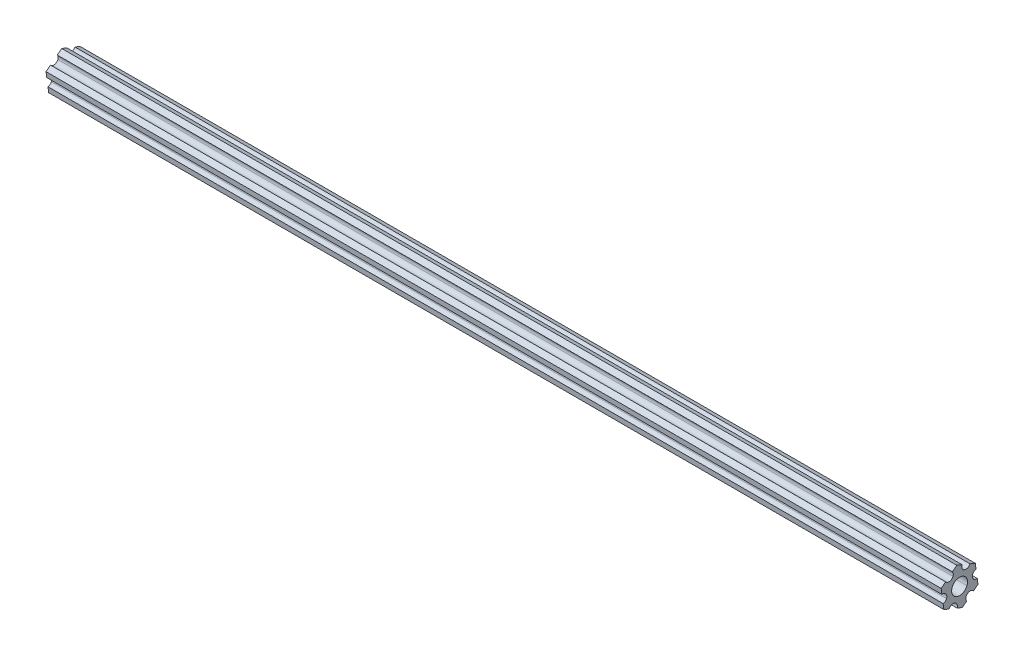
ISO-10303-21;
HEADER;
FILE_DESCRIPTION(('STEP AP214'),'2;1');
FILE_NAME('part.step','',(''),(''),'','','');
FILE_SCHEMA(('AUTOMOTIVE_DESIGN { 1 0 10303 214 1 1 1 1 }'));
ENDSEC;
DATA;
#1=APPLICATION_CONTEXT('core data for automotive mechanical design processes');
#2=APPLICATION_PROTOCOL_DEFINITION('international standard','automotive_design',2000,#1);
#3=PRODUCT_CONTEXT('',#1,'mechanical');
#4=PRODUCT('Part','Part','',(#3));
#5=PRODUCT_RELATED_PRODUCT_CATEGORY('part','',(#4));
#6=PRODUCT_DEFINITION_FORMATION('','',#4);
#7=PRODUCT_DEFINITION_CONTEXT('part definition',#1,'design');
#8=PRODUCT_DEFINITION('design','',#6,#7);
#9=PRODUCT_DEFINITION_SHAPE('','',#8);
#10=(LENGTH_UNIT() NAMED_UNIT(*) SI_UNIT(.MILLI.,.METRE.));
#11=(NAMED_UNIT(*) PLANE_ANGLE_UNIT() SI_UNIT($,.RADIAN.));
#12=(NAMED_UNIT(*) SI_UNIT($,.STERADIAN.) SOLID_ANGLE_UNIT());
#13=UNCERTAINTY_MEASURE_WITH_UNIT(LENGTH_MEASURE(1.E-05),#10,'distance_accuracy_value','');
#14=(GEOMETRIC_REPRESENTATION_CONTEXT(3) GLOBAL_UNCERTAINTY_ASSIGNED_CONTEXT((#13)) GLOBAL_UNIT_ASSIGNED_CONTEXT((#10,
#11,#12)) REPRESENTATION_CONTEXT('',''));
#15=CARTESIAN_POINT('',(0.,0.,0.));
#16=DIRECTION('',(0.,0.,1.));
#17=DIRECTION('',(1.,0.,0.));
#18=AXIS2_PLACEMENT_3D('',#15,#16,#17);
#19=CARTESIAN_POINT('',(270.736860808716,181.994820859661,458.283325004908));
#20=DIRECTION('',(-1.,0.,0.));
#21=DIRECTION('',(0.,-0.375584223552297,-0.926788266552085));
#22=AXIS2_PLACEMENT_3D('',#19,#20,#21);
#23=CYLINDRICAL_SURFACE('',#22,2.9337);
#24=CARTESIAN_POINT('',(140.561860808716,181.994820859661,458.283325004908));
#25=DIRECTION('',(1.,0.,0.));
#26=DIRECTION('',(0.,0.,-1.));
#27=AXIS2_PLACEMENT_3D('',#24,#25,#26);
#28=CIRCLE('',#27,2.9337);
#29=CARTESIAN_POINT('',(140.561860808716,180.892969423026,455.564406267324));
#30=VERTEX_POINT('',#29);
#31=CARTESIAN_POINT('',(140.561860808716,183.096672296296,461.002243742492));
#32=VERTEX_POINT('',#31);
#33=EDGE_CURVE('E72',#30,#32,#28,.F.);
#34=ORIENTED_EDGE('',*,*,#33,.F.);
#35=DIRECTION('',(-1.,0.,0.));
#36=VECTOR('',#35,1.);
#37=CARTESIAN_POINT('',(270.736860808716,180.892969423026,455.564406267324));
#38=LINE('',#37,#36);
#39=CARTESIAN_POINT('',(-189.638139191284,180.892969423026,455.564406267324));
#40=VERTEX_POINT('',#39);
#41=EDGE_CURVE('E225',#30,#40,#38,.T.);
#42=ORIENTED_EDGE('',*,*,#41,.T.);
#43=CARTESIAN_POINT('',(-189.638139191284,181.994820859661,458.283325004908));
#44=DIRECTION('',(1.,0.,0.));
#45=DIRECTION('',(0.,0.375584223552297,0.926788266552085));
#46=AXIS2_PLACEMENT_3D('',#43,#44,#45);
#47=CIRCLE('',#46,2.9337);
#48=CARTESIAN_POINT('',(-189.638139191284,183.096672296296,461.002243742492));
#49=VERTEX_POINT('',#48);
#50=EDGE_CURVE('E245',#49,#40,#47,.T.);
#51=ORIENTED_EDGE('',*,*,#50,.F.);
#52=DIRECTION('',(-1.,0.,0.));
#53=VECTOR('',#52,1.);
#54=CARTESIAN_POINT('',(270.736860808716,183.096672296296,461.002243742492));
#55=LINE('',#54,#53);
#56=EDGE_CURVE('E227',#32,#49,#55,.T.);
#57=ORIENTED_EDGE('',*,*,#56,.F.);
#58=EDGE_LOOP('',(#34,#42,#51,#57));
#59=FACE_BOUND('',#58,.T.);
#60=ADVANCED_FACE('F51',(#59),#23,.F.);
#61=CARTESIAN_POINT('',(270.736860808716,187.002809160181,462.187496259074));
#62=DIRECTION('',(-1.,0.,0.));
#63=DIRECTION('',(0.,-0.375584223552297,-0.926788266552085));
#64=AXIS2_PLACEMENT_3D('',#61,#62,#63);
#65=CYLINDRICAL_SURFACE('',#64,1.5875);
#66=CARTESIAN_POINT('',(140.561860808716,187.002809160181,462.187496259074));
#67=DIRECTION('',(1.,0.,0.));
#68=DIRECTION('',(0.,0.,-1.));
#69=AXIS2_PLACEMENT_3D('',#66,#67,#68);
#70=CIRCLE('',#69,1.5875);
#71=CARTESIAN_POINT('',(140.561860808716,187.978851973722,460.935499183944));
#72=VERTEX_POINT('',#71);
#73=CARTESIAN_POINT('',(140.561860808716,186.406569205292,460.716219885923));
#74=VERTEX_POINT('',#73);
#75=EDGE_CURVE('E66',#72,#74,#70,.F.);
#76=ORIENTED_EDGE('',*,*,#75,.F.);
#77=DIRECTION('',(-1.,0.,0.));
#78=VECTOR('',#77,1.);
#79=CARTESIAN_POINT('',(270.736860808716,187.978851973722,460.935499183944));
#80=LINE('',#79,#78);
#81=CARTESIAN_POINT('',(-189.638139191284,187.978851973722,460.935499183944));
#82=VERTEX_POINT('',#81);
#83=EDGE_CURVE('E59',#72,#82,#80,.T.);
#84=ORIENTED_EDGE('',*,*,#83,.T.);
#85=CARTESIAN_POINT('',(-189.638139191284,187.002809160181,462.187496259074));
#86=DIRECTION('',(-1.,0.,0.));
#87=DIRECTION('',(0.,0.375584223552297,0.926788266552085));
#88=AXIS2_PLACEMENT_3D('',#85,#86,#87);
#89=CIRCLE('',#88,1.5875);
#90=CARTESIAN_POINT('',(-189.638139191284,186.406569205292,460.716219885923));
#91=VERTEX_POINT('',#90);
#92=EDGE_CURVE('E266',#82,#91,#89,.T.);
#93=ORIENTED_EDGE('',*,*,#92,.T.);
#94=DIRECTION('',(-1.,0.,0.));
#95=VECTOR('',#94,1.);
#96=CARTESIAN_POINT('',(270.736860808716,186.406569205292,460.716219885923));
#97=LINE('',#96,#95);
#98=EDGE_CURVE('E233',#74,#91,#97,.T.);
#99=ORIENTED_EDGE('',*,*,#98,.F.);
#100=EDGE_LOOP('',(#76,#84,#93,#99));
#101=FACE_BOUND('',#100,.T.);
#102=ADVANCED_FACE('F53',(#101),#65,.F.);
#103=CARTESIAN_POINT('',(270.736860808716,189.256883484736,459.296132865671));
#104=DIRECTION('',(0.,-0.788659574884989,-0.614830118766338));
#105=DIRECTION('',(1.,0.,0.));
#106=AXIS2_PLACEMENT_3D('',#103,#104,#105);
#107=PLANE('',#106);
#108=DIRECTION('',(0.,-0.614830118766338,0.788659574884988));
#109=VECTOR('',#108,1.);
#110=CARTESIAN_POINT('',(140.561860808716,189.256883484736,459.296132865671));
#111=LINE('',#110,#109);
#112=CARTESIAN_POINT('',(140.561860808716,189.256883484736,459.296132865671));
#113=VERTEX_POINT('',#112);
#114=EDGE_CURVE('E395',#113,#72,#111,.T.);
#115=ORIENTED_EDGE('',*,*,#114,.F.);
#116=DIRECTION('',(-1.,0.,0.));
#117=VECTOR('',#116,1.);
#118=CARTESIAN_POINT('',(270.736860808716,189.256883484736,459.296132865671));
#119=LINE('',#118,#117);
#120=CARTESIAN_POINT('',(-189.638139191284,189.256883484736,459.296132865671));
#121=VERTEX_POINT('',#120);
#122=EDGE_CURVE('E276',#113,#121,#119,.T.);
#123=ORIENTED_EDGE('',*,*,#122,.T.);
#124=DIRECTION('',(0.,-0.614830118766338,0.788659574884989));
#125=VECTOR('',#124,1.);
#126=CARTESIAN_POINT('',(-189.638139191284,189.256883484736,459.296132865671));
#127=LINE('',#126,#125);
#128=EDGE_CURVE('E261',#121,#82,#127,.T.);
#129=ORIENTED_EDGE('',*,*,#128,.T.);
#130=ORIENTED_EDGE('',*,*,#83,.F.);
#131=EDGE_LOOP('',(#115,#123,#129,#130));
#132=FACE_BOUND('',#131,.T.);
#133=ADVANCED_FACE('F488',(#132),#107,.F.);
#134=CARTESIAN_POINT('',(270.736860808716,188.476166362509,457.369641951159));
#135=DIRECTION('',(0.,-0.926788289305943,0.37558416740508));
#136=DIRECTION('',(1.,0.,0.));
#137=AXIS2_PLACEMENT_3D('',#134,#135,#136);
#138=PLANE('',#137);
#139=DIRECTION('',(0.,0.375584167405079,0.926788289305941));
#140=VECTOR('',#139,1.);
#141=CARTESIAN_POINT('',(140.561860808716,188.476166362509,457.369641951159));
#142=LINE('',#141,#140);
#143=CARTESIAN_POINT('',(140.561860808716,188.476166362509,457.369641951159));
#144=VERTEX_POINT('',#143);
#145=EDGE_CURVE('E393',#144,#113,#142,.T.);
#146=ORIENTED_EDGE('',*,*,#145,.F.);
#147=DIRECTION('',(-1.,0.,0.));
#148=VECTOR('',#147,1.);
#149=CARTESIAN_POINT('',(270.736860808716,188.476166362509,457.369641951159));
#150=LINE('',#149,#148);
#151=CARTESIAN_POINT('',(-189.638139191284,188.476166362509,457.369641951159));
#152=VERTEX_POINT('',#151);
#153=EDGE_CURVE('E273',#144,#152,#150,.T.);
#154=ORIENTED_EDGE('',*,*,#153,.T.);
#155=DIRECTION('',(0.,0.37558416740508,0.926788289305943));
#156=VECTOR('',#155,1.);
#157=CARTESIAN_POINT('',(-189.638139191284,188.476166362509,457.369641951159));
#158=LINE('',#157,#156);
#159=EDGE_CURVE('E265',#152,#121,#158,.T.);
#160=ORIENTED_EDGE('',*,*,#159,.T.);
#161=ORIENTED_EDGE('',*,*,#122,.F.);
#162=EDGE_LOOP('',(#146,#154,#160,#161));
#163=FACE_BOUND('',#162,.T.);
#164=ADVANCED_FACE('F495',(#163),#138,.F.);
#165=CARTESIAN_POINT('',(270.736860808716,187.879926496754,455.898365541886));
#166=DIRECTION('',(-1.,0.,0.));
#167=DIRECTION('',(0.,-0.375584223552297,-0.926788266552085));
#168=AXIS2_PLACEMENT_3D('',#165,#166,#167);
#169=CYLINDRICAL_SURFACE('',#168,1.5875);
#170=CARTESIAN_POINT('',(140.561860808716,187.879926496754,455.898365541886));
#171=DIRECTION('',(1.,0.,0.));
#172=DIRECTION('',(0.,0.,-1.));
#173=AXIS2_PLACEMENT_3D('',#170,#171,#172);
#174=CIRCLE('',#173,1.5875);
#175=CARTESIAN_POINT('',(140.561860808716,187.283686630998,454.427089132612));
#176=VERTEX_POINT('',#175);
#177=EDGE_CURVE('E391',#176,#144,#174,.F.);
#178=ORIENTED_EDGE('',*,*,#177,.F.);
#179=DIRECTION('',(-1.,0.,0.));
#180=VECTOR('',#179,1.);
#181=CARTESIAN_POINT('',(270.736860808716,187.283686630998,454.427089132612));
#182=LINE('',#181,#180);
#183=CARTESIAN_POINT('',(-189.638139191284,187.283686630998,454.427089132612));
#184=VERTEX_POINT('',#183);
#185=EDGE_CURVE('E271',#176,#184,#182,.T.);
#186=ORIENTED_EDGE('',*,*,#185,.T.);
#187=CARTESIAN_POINT('',(-189.638139191284,187.879926496754,455.898365541886));
#188=DIRECTION('',(-1.,0.,0.));
#189=DIRECTION('',(0.,0.375584223552297,0.926788266552085));
#190=AXIS2_PLACEMENT_3D('',#187,#188,#189);
#191=CIRCLE('',#190,1.5875);
#192=EDGE_CURVE('E280',#184,#152,#191,.T.);
#193=ORIENTED_EDGE('',*,*,#192,.T.);
#194=ORIENTED_EDGE('',*,*,#153,.F.);
#195=EDGE_LOOP('',(#178,#186,#193,#194));
#196=FACE_BOUND('',#195,.T.);
#197=ADVANCED_FACE('F498',(#196),#169,.F.);
#198=CARTESIAN_POINT('',(270.736860808716,186.502969508772,452.500598218101));
#199=DIRECTION('',(0.,-0.926788289305948,0.375584167405068));
#200=DIRECTION('',(1.,0.,0.));
#201=AXIS2_PLACEMENT_3D('',#198,#199,#200);
#202=PLANE('',#201);
#203=DIRECTION('',(0.,0.375584167405067,0.926788289305946));
#204=VECTOR('',#203,1.);
#205=CARTESIAN_POINT('',(140.561860808716,186.502969508772,452.500598218101));
#206=LINE('',#205,#204);
#207=CARTESIAN_POINT('',(140.561860808716,186.502969508772,452.500598218101));
#208=VERTEX_POINT('',#207);
#209=EDGE_CURVE('E384',#208,#176,#206,.T.);
#210=ORIENTED_EDGE('',*,*,#209,.F.);
#211=DIRECTION('',(-1.,0.,0.));
#212=VECTOR('',#211,1.);
#213=CARTESIAN_POINT('',(270.736860808716,186.502969508772,452.500598218101));
#214=LINE('',#213,#212);
#215=CARTESIAN_POINT('',(-189.638139191284,186.502969508772,452.500598218101));
#216=VERTEX_POINT('',#215);
#217=EDGE_CURVE('E274',#208,#216,#214,.T.);
#218=ORIENTED_EDGE('',*,*,#217,.T.);
#219=DIRECTION('',(0.,0.375584167405068,0.926788289305948));
#220=VECTOR('',#219,1.);
#221=CARTESIAN_POINT('',(-189.638139191284,186.502969508772,452.500598218101));
#222=LINE('',#221,#220);
#223=EDGE_CURVE('E251',#216,#184,#222,.T.);
#224=ORIENTED_EDGE('',*,*,#223,.T.);
#225=ORIENTED_EDGE('',*,*,#185,.F.);
#226=EDGE_LOOP('',(#210,#218,#224,#225));
#227=FACE_BOUND('',#226,.T.);
#228=ADVANCED_FACE('F491',(#227),#202,.F.);
#229=CARTESIAN_POINT('',(270.736860808716,184.444220875531,452.213473621863));
#230=DIRECTION('',(0.,-0.138128714420944,0.990414286171408));
#231=DIRECTION('',(-1.,0.,0.));
#232=AXIS2_PLACEMENT_3D('',#229,#230,#231);
#233=PLANE('',#232);
#234=DIRECTION('',(0.,0.990414286171407,0.138128714420944));
#235=VECTOR('',#234,1.);
#236=CARTESIAN_POINT('',(140.561860808716,184.444220875531,452.213473621863));
#237=LINE('',#236,#235);
#238=CARTESIAN_POINT('',(140.561860808716,184.444220875531,452.213473621863));
#239=VERTEX_POINT('',#238);
#240=EDGE_CURVE('E381',#239,#208,#237,.T.);
#241=ORIENTED_EDGE('',*,*,#240,.F.);
#242=DIRECTION('',(-1.,0.,0.));
#243=VECTOR('',#242,1.);
#244=CARTESIAN_POINT('',(270.736860808716,184.444220875531,452.213473621863));
#245=LINE('',#244,#243);
#246=CARTESIAN_POINT('',(-189.638139191284,184.444220875531,452.213473621863));
#247=VERTEX_POINT('',#246);
#248=EDGE_CURVE('E285',#239,#247,#245,.T.);
#249=ORIENTED_EDGE('',*,*,#248,.T.);
#250=DIRECTION('',(0.,0.990414286171408,0.138128714420944));
#251=VECTOR('',#250,1.);
#252=CARTESIAN_POINT('',(-189.638139191284,184.444220875531,452.213473621863));
#253=LINE('',#252,#251);
#254=EDGE_CURVE('E246',#247,#216,#253,.T.);
#255=ORIENTED_EDGE('',*,*,#254,.T.);
#256=ORIENTED_EDGE('',*,*,#217,.F.);
#257=EDGE_LOOP('',(#241,#249,#255,#256));
#258=FACE_BOUND('',#257,.T.);
#259=ADVANCED_FACE('F635',(#258),#233,.F.);
#260=CARTESIAN_POINT('',(270.736860808716,182.871938196234,451.99419428772));
#261=DIRECTION('',(-1.,0.,0.));
#262=DIRECTION('',(0.,-0.375584223552297,-0.926788266552085));
#263=AXIS2_PLACEMENT_3D('',#260,#261,#262);
#264=CYLINDRICAL_SURFACE('',#263,1.5875);
#265=CARTESIAN_POINT('',(140.561860808716,182.871938196234,451.99419428772));
#266=DIRECTION('',(1.,0.,0.));
#267=DIRECTION('',(0.,0.,-1.));
#268=AXIS2_PLACEMENT_3D('',#265,#266,#267);
#269=CIRCLE('',#268,1.5875);
#270=CARTESIAN_POINT('',(140.561860808716,181.299655516937,451.774914953576));
#271=VERTEX_POINT('',#270);
#272=EDGE_CURVE('E379',#271,#239,#269,.F.);
#273=ORIENTED_EDGE('',*,*,#272,.F.);
#274=DIRECTION('',(-1.,0.,0.));
#275=VECTOR('',#274,1.);
#276=CARTESIAN_POINT('',(270.736860808716,181.299655516937,451.774914953576));
#277=LINE('',#276,#275);
#278=CARTESIAN_POINT('',(-189.638139191284,181.299655516937,451.774914953576));
#279=VERTEX_POINT('',#278);
#280=EDGE_CURVE('E269',#271,#279,#277,.T.);
#281=ORIENTED_EDGE('',*,*,#280,.T.);
#282=CARTESIAN_POINT('',(-189.638139191284,182.871938196234,451.99419428772));
#283=DIRECTION('',(-1.,0.,0.));
#284=DIRECTION('',(0.,0.375584223552297,0.926788266552085));
#285=AXIS2_PLACEMENT_3D('',#282,#283,#284);
#286=CIRCLE('',#285,1.5875);
#287=EDGE_CURVE('E250',#279,#247,#286,.T.);
#288=ORIENTED_EDGE('',*,*,#287,.T.);
#289=ORIENTED_EDGE('',*,*,#248,.F.);
#290=EDGE_LOOP('',(#273,#281,#288,#289));
#291=FACE_BOUND('',#290,.T.);
#292=ADVANCED_FACE('F377',(#291),#264,.F.);
#293=CARTESIAN_POINT('',(270.736860808716,179.240906883697,451.487790357338));
#294=DIRECTION('',(0.,-0.138128714420944,0.990414286171407));
#295=DIRECTION('',(-1.,0.,0.));
#296=AXIS2_PLACEMENT_3D('',#293,#294,#295);
#297=PLANE('',#296);
#298=DIRECTION('',(0.,0.990414286171407,0.138128714420944));
#299=VECTOR('',#298,1.);
#300=CARTESIAN_POINT('',(140.561860808716,179.240906883697,451.487790357338));
#301=LINE('',#300,#299);
#302=CARTESIAN_POINT('',(140.561860808716,179.240906883697,451.487790357338));
#303=VERTEX_POINT('',#302);
#304=EDGE_CURVE('E382',#303,#271,#301,.T.);
#305=ORIENTED_EDGE('',*,*,#304,.F.);
#306=DIRECTION('',(-1.,0.,0.));
#307=VECTOR('',#306,1.);
#308=CARTESIAN_POINT('',(270.736860808716,179.240906883697,451.487790357338));
#309=LINE('',#308,#307);
#310=CARTESIAN_POINT('',(-189.638139191284,179.240906883697,451.487790357338));
#311=VERTEX_POINT('',#310);
#312=EDGE_CURVE('E267',#303,#311,#309,.T.);
#313=ORIENTED_EDGE('',*,*,#312,.T.);
#314=DIRECTION('',(0.,0.990414286171407,0.138128714420944));
#315=VECTOR('',#314,1.);
#316=CARTESIAN_POINT('',(-189.638139191284,179.240906883697,451.487790357338));
#317=LINE('',#316,#315);
#318=EDGE_CURVE('E338',#311,#279,#317,.T.);
#319=ORIENTED_EDGE('',*,*,#318,.T.);
#320=ORIENTED_EDGE('',*,*,#280,.F.);
#321=EDGE_LOOP('',(#305,#313,#319,#320));
#322=FACE_BOUND('',#321,.T.);
#323=ADVANCED_FACE('F374',(#322),#297,.F.);
#324=CARTESIAN_POINT('',(270.736860808716,177.962875372683,453.127156675612));
#325=DIRECTION('',(0.,0.788659574884996,0.614830118766329));
#326=DIRECTION('',(-1.,0.,0.));
#327=AXIS2_PLACEMENT_3D('',#324,#325,#326);
#328=PLANE('',#327);
#329=DIRECTION('',(0.,0.614830118766329,-0.788659574884996));
#330=VECTOR('',#329,1.);
#331=CARTESIAN_POINT('',(140.561860808716,177.962875372683,453.127156675612));
#332=LINE('',#331,#330);
#333=CARTESIAN_POINT('',(140.561860808716,177.962875372683,453.127156675612));
#334=VERTEX_POINT('',#333);
#335=EDGE_CURVE('E386',#334,#303,#332,.T.);
#336=ORIENTED_EDGE('',*,*,#335,.F.);
#337=DIRECTION('',(-1.,0.,0.));
#338=VECTOR('',#337,1.);
#339=CARTESIAN_POINT('',(270.736860808716,177.962875372683,453.127156675612));
#340=LINE('',#339,#338);
#341=CARTESIAN_POINT('',(-189.638139191284,177.962875372683,453.127156675612));
#342=VERTEX_POINT('',#341);
#343=EDGE_CURVE('E270',#334,#342,#340,.T.);
#344=ORIENTED_EDGE('',*,*,#343,.T.);
#345=DIRECTION('',(0.,0.614830118766329,-0.788659574884996));
#346=VECTOR('',#345,1.);
#347=CARTESIAN_POINT('',(-189.638139191284,177.962875372683,453.127156675612));
#348=LINE('',#347,#346);
#349=EDGE_CURVE('E337',#342,#311,#348,.T.);
#350=ORIENTED_EDGE('',*,*,#349,.T.);
#351=ORIENTED_EDGE('',*,*,#312,.F.);
#352=EDGE_LOOP('',(#336,#344,#350,#351));
#353=FACE_BOUND('',#352,.T.);
#354=ADVANCED_FACE('F362',(#353),#328,.F.);
#355=CARTESIAN_POINT('',(270.736860808716,176.986832559141,454.379153750742));
#356=DIRECTION('',(-1.,0.,0.));
#357=DIRECTION('',(0.,-0.375584223552297,-0.926788266552085));
#358=AXIS2_PLACEMENT_3D('',#355,#356,#357);
#359=CYLINDRICAL_SURFACE('',#358,1.5875);
#360=CARTESIAN_POINT('',(140.561860808716,176.986832559141,454.379153750742));
#361=DIRECTION('',(1.,0.,0.));
#362=DIRECTION('',(0.,0.,-1.));
#363=AXIS2_PLACEMENT_3D('',#360,#361,#362);
#364=CIRCLE('',#363,1.5875);
#365=CARTESIAN_POINT('',(140.561860808716,176.0107897456,455.631150825872));
#366=VERTEX_POINT('',#365);
#367=EDGE_CURVE('E439',#366,#334,#364,.F.);
#368=ORIENTED_EDGE('',*,*,#367,.F.);
#369=DIRECTION('',(-1.,0.,0.));
#370=VECTOR('',#369,1.);
#371=CARTESIAN_POINT('',(270.736860808716,176.0107897456,455.631150825872));
#372=LINE('',#371,#370);
#373=CARTESIAN_POINT('',(-189.638139191284,176.0107897456,455.631150825872));
#374=VERTEX_POINT('',#373);
#375=EDGE_CURVE('E281',#366,#374,#372,.T.);
#376=ORIENTED_EDGE('',*,*,#375,.T.);
#377=CARTESIAN_POINT('',(-189.638139191284,176.986832559141,454.379153750742));
#378=DIRECTION('',(-1.,0.,0.));
#379=DIRECTION('',(0.,0.375584223552297,0.926788266552085));
#380=AXIS2_PLACEMENT_3D('',#377,#378,#379);
#381=CIRCLE('',#380,1.5875);
#382=EDGE_CURVE('E332',#374,#342,#381,.T.);
#383=ORIENTED_EDGE('',*,*,#382,.T.);
#384=ORIENTED_EDGE('',*,*,#343,.F.);
#385=EDGE_LOOP('',(#368,#376,#383,#384));
#386=FACE_BOUND('',#385,.T.);
#387=ADVANCED_FACE('F442',(#386),#359,.F.);
#388=CARTESIAN_POINT('',(270.736860808716,174.732758234586,457.270517144145));
#389=DIRECTION('',(0.,0.788659574884989,0.614830118766337));
#390=DIRECTION('',(-1.,0.,0.));
#391=AXIS2_PLACEMENT_3D('',#388,#389,#390);
#392=PLANE('',#391);
#393=DIRECTION('',(0.,0.614830118766337,-0.788659574884989));
#394=VECTOR('',#393,1.);
#395=CARTESIAN_POINT('',(140.561860808716,174.732758234586,457.270517144145));
#396=LINE('',#395,#394);
#397=CARTESIAN_POINT('',(140.561860808716,174.732758234586,457.270517144145));
#398=VERTEX_POINT('',#397);
#399=EDGE_CURVE('E437',#398,#366,#396,.T.);
#400=ORIENTED_EDGE('',*,*,#399,.F.);
#401=DIRECTION('',(-1.,0.,0.));
#402=VECTOR('',#401,1.);
#403=CARTESIAN_POINT('',(270.736860808716,174.732758234586,457.270517144145));
#404=LINE('',#403,#402);
#405=CARTESIAN_POINT('',(-189.638139191284,174.732758234586,457.270517144145));
#406=VERTEX_POINT('',#405);
#407=EDGE_CURVE('E283',#398,#406,#404,.T.);
#408=ORIENTED_EDGE('',*,*,#407,.T.);
#409=DIRECTION('',(0.,0.614830118766337,-0.78865957488499));
#410=VECTOR('',#409,1.);
#411=CARTESIAN_POINT('',(-189.638139191284,174.732758234586,457.270517144145));
#412=LINE('',#411,#410);
#413=EDGE_CURVE('E313',#406,#374,#412,.T.);
#414=ORIENTED_EDGE('',*,*,#413,.T.);
#415=ORIENTED_EDGE('',*,*,#375,.F.);
#416=EDGE_LOOP('',(#400,#408,#414,#415));
#417=FACE_BOUND('',#416,.T.);
#418=ADVANCED_FACE('F449',(#417),#392,.F.);
#419=CARTESIAN_POINT('',(270.736860808716,175.513475356813,459.197008058657));
#420=DIRECTION('',(0.,0.926788289305952,-0.375584167405058));
#421=DIRECTION('',(-1.,0.,0.));
#422=AXIS2_PLACEMENT_3D('',#419,#420,#421);
#423=PLANE('',#422);
#424=DIRECTION('',(0.,-0.375584167405057,-0.926788289305951));
#425=VECTOR('',#424,1.);
#426=CARTESIAN_POINT('',(140.561860808716,175.513475356813,459.197008058657));
#427=LINE('',#426,#425);
#428=CARTESIAN_POINT('',(140.561860808716,175.513475356813,459.197008058657));
#429=VERTEX_POINT('',#428);
#430=EDGE_CURVE('E435',#429,#398,#427,.T.);
#431=ORIENTED_EDGE('',*,*,#430,.F.);
#432=DIRECTION('',(-1.,0.,0.));
#433=VECTOR('',#432,1.);
#434=CARTESIAN_POINT('',(270.736860808716,175.513475356813,459.197008058657));
#435=LINE('',#434,#433);
#436=CARTESIAN_POINT('',(-189.638139191284,175.513475356813,459.197008058657));
#437=VERTEX_POINT('',#436);
#438=EDGE_CURVE('E303',#429,#437,#435,.T.);
#439=ORIENTED_EDGE('',*,*,#438,.T.);
#440=DIRECTION('',(0.,-0.375584167405058,-0.926788289305952));
#441=VECTOR('',#440,1.);
#442=CARTESIAN_POINT('',(-189.638139191284,175.513475356813,459.197008058657));
#443=LINE('',#442,#441);
#444=EDGE_CURVE('E309',#437,#406,#443,.T.);
#445=ORIENTED_EDGE('',*,*,#444,.T.);
#446=ORIENTED_EDGE('',*,*,#407,.F.);
#447=EDGE_LOOP('',(#431,#439,#445,#446));
#448=FACE_BOUND('',#447,.T.);
#449=ADVANCED_FACE('F453',(#448),#423,.F.);
#450=CARTESIAN_POINT('',(270.736860808716,176.109715222568,460.66828446793));
#451=DIRECTION('',(-1.,0.,0.));
#452=DIRECTION('',(0.,-0.375584223552297,-0.926788266552085));
#453=AXIS2_PLACEMENT_3D('',#450,#451,#452);
#454=CYLINDRICAL_SURFACE('',#453,1.5875);
#455=CARTESIAN_POINT('',(140.561860808716,176.109715222568,460.66828446793));
#456=DIRECTION('',(1.,0.,0.));
#457=DIRECTION('',(0.,0.,-1.));
#458=AXIS2_PLACEMENT_3D('',#455,#456,#457);
#459=CIRCLE('',#458,1.5875);
#460=CARTESIAN_POINT('',(140.561860808716,176.705955088324,462.139560877204));
#461=VERTEX_POINT('',#460);
#462=EDGE_CURVE('E433',#461,#429,#459,.F.);
#463=ORIENTED_EDGE('',*,*,#462,.F.);
#464=DIRECTION('',(-1.,0.,0.));
#465=VECTOR('',#464,1.);
#466=CARTESIAN_POINT('',(270.736860808716,176.705955088324,462.139560877204));
#467=LINE('',#466,#465);
#468=CARTESIAN_POINT('',(-189.638139191284,176.705955088324,462.139560877204));
#469=VERTEX_POINT('',#468);
#470=EDGE_CURVE('E301',#461,#469,#467,.T.);
#471=ORIENTED_EDGE('',*,*,#470,.T.);
#472=CARTESIAN_POINT('',(-189.638139191284,176.109715222568,460.66828446793));
#473=DIRECTION('',(-1.,0.,0.));
#474=DIRECTION('',(0.,0.375584223552297,0.926788266552085));
#475=AXIS2_PLACEMENT_3D('',#472,#473,#474);
#476=CIRCLE('',#475,1.5875);
#477=EDGE_CURVE('E312',#469,#437,#476,.T.);
#478=ORIENTED_EDGE('',*,*,#477,.T.);
#479=ORIENTED_EDGE('',*,*,#438,.F.);
#480=EDGE_LOOP('',(#463,#471,#478,#479));
#481=FACE_BOUND('',#480,.T.);
#482=ADVANCED_FACE('F457',(#481),#454,.F.);
#483=CARTESIAN_POINT('',(270.736860808716,177.48667221055,464.066051791715));
#484=DIRECTION('',(0.,0.926788289305948,-0.375584167405068));
#485=DIRECTION('',(-1.,0.,0.));
#486=AXIS2_PLACEMENT_3D('',#483,#484,#485);
#487=PLANE('',#486);
#488=DIRECTION('',(0.,-0.375584167405067,-0.926788289305946));
#489=VECTOR('',#488,1.);
#490=CARTESIAN_POINT('',(140.561860808716,177.48667221055,464.066051791715));
#491=LINE('',#490,#489);
#492=CARTESIAN_POINT('',(140.561860808716,177.48667221055,464.066051791715));
#493=VERTEX_POINT('',#492);
#494=EDGE_CURVE('E431',#493,#461,#491,.T.);
#495=ORIENTED_EDGE('',*,*,#494,.F.);
#496=DIRECTION('',(-1.,0.,0.));
#497=VECTOR('',#496,1.);
#498=CARTESIAN_POINT('',(270.736860808716,177.48667221055,464.066051791715));
#499=LINE('',#498,#497);
#500=CARTESIAN_POINT('',(-189.638139191284,177.48667221055,464.066051791715));
#501=VERTEX_POINT('',#500);
#502=EDGE_CURVE('E304',#493,#501,#499,.T.);
#503=ORIENTED_EDGE('',*,*,#502,.T.);
#504=DIRECTION('',(0.,-0.375584167405068,-0.926788289305948));
#505=VECTOR('',#504,1.);
#506=CARTESIAN_POINT('',(-189.638139191284,177.48667221055,464.066051791715));
#507=LINE('',#506,#505);
#508=EDGE_CURVE('E256',#501,#469,#507,.T.);
#509=ORIENTED_EDGE('',*,*,#508,.T.);
#510=ORIENTED_EDGE('',*,*,#470,.F.);
#511=EDGE_LOOP('',(#495,#503,#509,#510));
#512=FACE_BOUND('',#511,.T.);
#513=ADVANCED_FACE('F463',(#512),#487,.F.);
#514=CARTESIAN_POINT('',(270.736860808716,179.545420843791,464.353176387953));
#515=DIRECTION('',(0.,0.138128714420945,-0.990414286171407));
#516=DIRECTION('',(0.,-0.990414286171407,-0.138128714420945));
#517=AXIS2_PLACEMENT_3D('',#514,#515,#516);
#518=PLANE('',#517);
#519=DIRECTION('',(0.,-0.990414286171407,-0.138128714420945));
#520=VECTOR('',#519,1.);
#521=CARTESIAN_POINT('',(140.561860808716,179.545420843791,464.353176387953));
#522=LINE('',#521,#520);
#523=CARTESIAN_POINT('',(140.561860808716,179.545420843791,464.353176387953));
#524=VERTEX_POINT('',#523);
#525=EDGE_CURVE('E429',#524,#493,#522,.T.);
#526=ORIENTED_EDGE('',*,*,#525,.F.);
#527=DIRECTION('',(-1.,0.,0.));
#528=VECTOR('',#527,1.);
#529=CARTESIAN_POINT('',(270.736860808716,179.545420843791,464.353176387953));
#530=LINE('',#529,#528);
#531=CARTESIAN_POINT('',(-189.638139191284,179.545420843791,464.353176387953));
#532=VERTEX_POINT('',#531);
#533=EDGE_CURVE('E298',#524,#532,#530,.T.);
#534=ORIENTED_EDGE('',*,*,#533,.T.);
#535=DIRECTION('',(0.,-0.990414286171407,-0.138128714420945));
#536=VECTOR('',#535,1.);
#537=CARTESIAN_POINT('',(-189.638139191284,179.545420843791,464.353176387953));
#538=LINE('',#537,#536);
#539=EDGE_CURVE('E252',#532,#501,#538,.T.);
#540=ORIENTED_EDGE('',*,*,#539,.T.);
#541=ORIENTED_EDGE('',*,*,#502,.F.);
#542=EDGE_LOOP('',(#526,#534,#540,#541));
#543=FACE_BOUND('',#542,.T.);
#544=ADVANCED_FACE('F467',(#543),#518,.F.);
#545=CARTESIAN_POINT('',(270.736860808716,181.117703523088,464.572455722096));
#546=DIRECTION('',(-1.,0.,0.));
#547=DIRECTION('',(0.,-0.375584223552297,-0.926788266552085));
#548=AXIS2_PLACEMENT_3D('',#545,#546,#547);
#549=CYLINDRICAL_SURFACE('',#548,1.5875);
#550=CARTESIAN_POINT('',(140.561860808716,181.117703523088,464.572455722096));
#551=DIRECTION('',(1.,0.,0.));
#552=DIRECTION('',(0.,0.,-1.));
#553=AXIS2_PLACEMENT_3D('',#550,#551,#552);
#554=CIRCLE('',#553,1.5875);
#555=CARTESIAN_POINT('',(140.561860808716,182.689986202385,464.79173505624));
#556=VERTEX_POINT('',#555);
#557=CARTESIAN_POINT('',(140.561860808716,180.521463568199,463.101179348945));
#558=VERTEX_POINT('',#557);
#559=EDGE_CURVE('E420',#556,#558,#554,.F.);
#560=ORIENTED_EDGE('',*,*,#559,.F.);
#561=DIRECTION('',(-1.,0.,0.));
#562=VECTOR('',#561,1.);
#563=CARTESIAN_POINT('',(270.736860808716,182.689986202385,464.79173505624));
#564=LINE('',#563,#562);
#565=CARTESIAN_POINT('',(-189.638139191284,182.689986202385,464.79173505624));
#566=VERTEX_POINT('',#565);
#567=EDGE_CURVE('E241',#556,#566,#564,.T.);
#568=ORIENTED_EDGE('',*,*,#567,.T.);
#569=CARTESIAN_POINT('',(-189.638139191284,181.117703523088,464.572455722096));
#570=DIRECTION('',(-1.,0.,0.));
#571=DIRECTION('',(0.,0.375584223552297,0.926788266552085));
#572=AXIS2_PLACEMENT_3D('',#569,#570,#571);
#573=CIRCLE('',#572,1.5875);
#574=CARTESIAN_POINT('',(-189.638139191284,180.521463568199,463.101179348945));
#575=VERTEX_POINT('',#574);
#576=EDGE_CURVE('E255',#566,#575,#573,.T.);
#577=ORIENTED_EDGE('',*,*,#576,.T.);
#578=DIRECTION('',(-1.,0.,0.));
#579=VECTOR('',#578,1.);
#580=CARTESIAN_POINT('',(270.736860808716,180.521463568199,463.101179348945));
#581=LINE('',#580,#579);
#582=EDGE_CURVE('E286',#558,#575,#581,.T.);
#583=ORIENTED_EDGE('',*,*,#582,.F.);
#584=EDGE_LOOP('',(#560,#568,#577,#583));
#585=FACE_BOUND('',#584,.T.);
#586=ADVANCED_FACE('F474',(#585),#549,.F.);
#587=CARTESIAN_POINT('',(270.736860808716,184.748734835625,465.078859652478));
#588=DIRECTION('',(0.,0.138128714420958,-0.990414286171406));
#589=DIRECTION('',(0.,-0.990414286171406,-0.138128714420958));
#590=AXIS2_PLACEMENT_3D('',#587,#588,#589);
#591=PLANE('',#590);
#592=DIRECTION('',(0.,-0.990414286171405,-0.138128714420958));
#593=VECTOR('',#592,1.);
#594=CARTESIAN_POINT('',(140.561860808716,184.748734835625,465.078859652478));
#595=LINE('',#594,#593);
#596=CARTESIAN_POINT('',(140.561860808716,184.748734835625,465.078859652478));
#597=VERTEX_POINT('',#596);
#598=EDGE_CURVE('E418',#597,#556,#595,.T.);
#599=ORIENTED_EDGE('',*,*,#598,.F.);
#600=DIRECTION('',(-1.,0.,0.));
#601=VECTOR('',#600,1.);
#602=CARTESIAN_POINT('',(270.736860808716,184.748734835625,465.078859652478));
#603=LINE('',#602,#601);
#604=CARTESIAN_POINT('',(-189.638139191284,184.748734835625,465.078859652478));
#605=VERTEX_POINT('',#604);
#606=EDGE_CURVE('E243',#597,#605,#603,.T.);
#607=ORIENTED_EDGE('',*,*,#606,.T.);
#608=DIRECTION('',(0.,-0.990414286171406,-0.138128714420958));
#609=VECTOR('',#608,1.);
#610=CARTESIAN_POINT('',(-189.638139191284,184.748734835625,465.078859652478));
#611=LINE('',#610,#609);
#612=EDGE_CURVE('E257',#605,#566,#611,.T.);
#613=ORIENTED_EDGE('',*,*,#612,.T.);
#614=ORIENTED_EDGE('',*,*,#567,.F.);
#615=EDGE_LOOP('',(#599,#607,#613,#614));
#616=FACE_BOUND('',#615,.T.);
#617=ADVANCED_FACE('F416',(#616),#591,.F.);
#618=CARTESIAN_POINT('',(270.736860808716,186.026766346639,463.439493334204));
#619=DIRECTION('',(0.,-0.788659574884997,-0.614830118766327));
#620=DIRECTION('',(1.,0.,0.));
#621=AXIS2_PLACEMENT_3D('',#618,#619,#620);
#622=PLANE('',#621);
#623=DIRECTION('',(0.,-0.614830118766327,0.788659574884997));
#624=VECTOR('',#623,1.);
#625=CARTESIAN_POINT('',(140.561860808716,186.026766346639,463.439493334204));
#626=LINE('',#625,#624);
#627=CARTESIAN_POINT('',(140.561860808716,186.026766346639,463.439493334204));
#628=VERTEX_POINT('',#627);
#629=EDGE_CURVE('E413',#628,#597,#626,.T.);
#630=ORIENTED_EDGE('',*,*,#629,.F.);
#631=DIRECTION('',(-1.,0.,0.));
#632=VECTOR('',#631,1.);
#633=CARTESIAN_POINT('',(270.736860808716,186.026766346639,463.439493334204));
#634=LINE('',#633,#632);
#635=CARTESIAN_POINT('',(-189.638139191284,186.026766346639,463.439493334204));
#636=VERTEX_POINT('',#635);
#637=EDGE_CURVE('E289',#628,#636,#634,.T.);
#638=ORIENTED_EDGE('',*,*,#637,.T.);
#639=DIRECTION('',(0.,-0.614830118766327,0.788659574884997));
#640=VECTOR('',#639,1.);
#641=CARTESIAN_POINT('',(-189.638139191284,186.026766346639,463.439493334204));
#642=LINE('',#641,#640);
#643=EDGE_CURVE('E300',#636,#605,#642,.T.);
#644=ORIENTED_EDGE('',*,*,#643,.T.);
#645=ORIENTED_EDGE('',*,*,#606,.F.);
#646=EDGE_LOOP('',(#630,#638,#644,#645));
#647=FACE_BOUND('',#646,.T.);
#648=ADVANCED_FACE('F412',(#647),#622,.F.);
#649=CARTESIAN_POINT('',(270.736860808716,181.117703523088,464.572455722096));
#650=DIRECTION('',(-1.,0.,0.));
#651=DIRECTION('',(0.,-0.375584223552297,-0.926788266552085));
#652=AXIS2_PLACEMENT_3D('',#649,#650,#651);
#653=CYLINDRICAL_SURFACE('',#652,1.5875);
#654=CARTESIAN_POINT('',(140.561860808716,181.117703523088,464.572455722096));
#655=DIRECTION('',(1.,0.,0.));
#656=DIRECTION('',(0.,0.,-1.));
#657=AXIS2_PLACEMENT_3D('',#654,#655,#656);
#658=CIRCLE('',#657,1.5875);
#659=EDGE_CURVE('E427',#558,#524,#658,.F.);
#660=ORIENTED_EDGE('',*,*,#659,.F.);
#661=ORIENTED_EDGE('',*,*,#582,.T.);
#662=CARTESIAN_POINT('',(-189.638139191284,181.117703523088,464.572455722096));
#663=DIRECTION('',(-1.,0.,0.));
#664=DIRECTION('',(0.,0.375584223552297,0.926788266552085));
#665=AXIS2_PLACEMENT_3D('',#662,#663,#664);
#666=CIRCLE('',#665,1.5875);
#667=EDGE_CURVE('E288',#575,#532,#666,.T.);
#668=ORIENTED_EDGE('',*,*,#667,.T.);
#669=ORIENTED_EDGE('',*,*,#533,.F.);
#670=EDGE_LOOP('',(#660,#661,#668,#669));
#671=FACE_BOUND('',#670,.T.);
#672=ADVANCED_FACE('F471',(#671),#653,.F.);
#673=CARTESIAN_POINT('',(270.736860808716,187.002809160181,462.187496259074));
#674=DIRECTION('',(-1.,0.,0.));
#675=DIRECTION('',(0.,-0.375584223552297,-0.926788266552085));
#676=AXIS2_PLACEMENT_3D('',#673,#674,#675);
#677=CYLINDRICAL_SURFACE('',#676,1.5875);
#678=CARTESIAN_POINT('',(140.561860808716,187.002809160181,462.187496259074));
#679=DIRECTION('',(1.,0.,0.));
#680=DIRECTION('',(0.,0.,-1.));
#681=AXIS2_PLACEMENT_3D('',#678,#679,#680);
#682=CIRCLE('',#681,1.5875);
#683=EDGE_CURVE('E228',#74,#628,#682,.F.);
#684=ORIENTED_EDGE('',*,*,#683,.F.);
#685=ORIENTED_EDGE('',*,*,#98,.T.);
#686=CARTESIAN_POINT('',(-189.638139191284,187.002809160181,462.187496259074));
#687=DIRECTION('',(-1.,0.,0.));
#688=DIRECTION('',(0.,0.375584223552297,0.926788266552085));
#689=AXIS2_PLACEMENT_3D('',#686,#687,#688);
#690=CIRCLE('',#689,1.5875);
#691=EDGE_CURVE('E235',#91,#636,#690,.T.);
#692=ORIENTED_EDGE('',*,*,#691,.T.);
#693=ORIENTED_EDGE('',*,*,#637,.F.);
#694=EDGE_LOOP('',(#684,#685,#692,#693));
#695=FACE_BOUND('',#694,.T.);
#696=ADVANCED_FACE('F511',(#695),#677,.F.);
#697=CARTESIAN_POINT('',(270.736860808716,181.994820859661,458.283325004908));
#698=DIRECTION('',(-1.,0.,0.));
#699=DIRECTION('',(0.,-0.375584223552297,-0.926788266552085));
#700=AXIS2_PLACEMENT_3D('',#697,#698,#699);
#701=CYLINDRICAL_SURFACE('',#700,2.9337);
#702=CARTESIAN_POINT('',(140.561860808716,181.994820859661,458.283325004908));
#703=DIRECTION('',(1.,0.,0.));
#704=DIRECTION('',(0.,0.,-1.));
#705=AXIS2_PLACEMENT_3D('',#702,#703,#704);
#706=CIRCLE('',#705,2.9337);
#707=EDGE_CURVE('E12',#32,#30,#706,.F.);
#708=ORIENTED_EDGE('',*,*,#707,.F.);
#709=ORIENTED_EDGE('',*,*,#56,.T.);
#710=CARTESIAN_POINT('',(-189.638139191284,181.994820859661,458.283325004908));
#711=DIRECTION('',(1.,0.,0.));
#712=DIRECTION('',(0.,0.375584223552297,0.926788266552085));
#713=AXIS2_PLACEMENT_3D('',#710,#711,#712);
#714=CIRCLE('',#713,2.9337);
#715=EDGE_CURVE('E232',#40,#49,#714,.T.);
#716=ORIENTED_EDGE('',*,*,#715,.F.);
#717=ORIENTED_EDGE('',*,*,#41,.F.);
#718=EDGE_LOOP('',(#708,#709,#716,#717));
#719=FACE_BOUND('',#718,.T.);
#720=ADVANCED_FACE('F230',(#719),#701,.F.);
#721=CARTESIAN_POINT('',(-189.638139191284,181.117703523088,464.572455722096));
#722=DIRECTION('',(1.,0.,0.));
#723=DIRECTION('',(0.,0.375584223552297,0.926788266552085));
#724=AXIS2_PLACEMENT_3D('',#721,#722,#723);
#725=PLANE('',#724);
#726=ORIENTED_EDGE('',*,*,#50,.T.);
#727=ORIENTED_EDGE('',*,*,#715,.T.);
#728=EDGE_LOOP('',(#726,#727));
#729=FACE_BOUND('',#728,.T.);
#730=ORIENTED_EDGE('',*,*,#508,.F.);
#731=ORIENTED_EDGE('',*,*,#539,.F.);
#732=ORIENTED_EDGE('',*,*,#667,.F.);
#733=ORIENTED_EDGE('',*,*,#576,.F.);
#734=ORIENTED_EDGE('',*,*,#612,.F.);
#735=ORIENTED_EDGE('',*,*,#643,.F.);
#736=ORIENTED_EDGE('',*,*,#691,.F.);
#737=ORIENTED_EDGE('',*,*,#92,.F.);
#738=ORIENTED_EDGE('',*,*,#128,.F.);
#739=ORIENTED_EDGE('',*,*,#159,.F.);
#740=ORIENTED_EDGE('',*,*,#192,.F.);
#741=ORIENTED_EDGE('',*,*,#223,.F.);
#742=ORIENTED_EDGE('',*,*,#254,.F.);
#743=ORIENTED_EDGE('',*,*,#287,.F.);
#744=ORIENTED_EDGE('',*,*,#318,.F.);
#745=ORIENTED_EDGE('',*,*,#349,.F.);
#746=ORIENTED_EDGE('',*,*,#382,.F.);
#747=ORIENTED_EDGE('',*,*,#413,.F.);
#748=ORIENTED_EDGE('',*,*,#444,.F.);
#749=ORIENTED_EDGE('',*,*,#477,.F.);
#750=EDGE_LOOP('',(#730,#731,#732,#733,#734,#735,#736,#737,#738,#739,#740,#741,#742,#743,#744,
#745,#746,#747,#748,#749));
#751=FACE_BOUND('',#750,.T.);
#752=ADVANCED_FACE('F368',(#729,#751),#725,.F.);
#753=CARTESIAN_POINT('',(140.561860808716,127.82587041186,458.536962788806));
#754=DIRECTION('',(1.,0.,0.));
#755=DIRECTION('',(0.,0.,-1.));
#756=AXIS2_PLACEMENT_3D('',#753,#754,#755);
#757=PLANE('',#756);
#758=ORIENTED_EDGE('',*,*,#33,.T.);
#759=ORIENTED_EDGE('',*,*,#707,.T.);
#760=EDGE_LOOP('',(#758,#759));
#761=FACE_BOUND('',#760,.T.);
#762=ORIENTED_EDGE('',*,*,#114,.T.);
#763=ORIENTED_EDGE('',*,*,#75,.T.);
#764=ORIENTED_EDGE('',*,*,#683,.T.);
#765=ORIENTED_EDGE('',*,*,#629,.T.);
#766=ORIENTED_EDGE('',*,*,#598,.T.);
#767=ORIENTED_EDGE('',*,*,#559,.T.);
#768=ORIENTED_EDGE('',*,*,#659,.T.);
#769=ORIENTED_EDGE('',*,*,#525,.T.);
#770=ORIENTED_EDGE('',*,*,#494,.T.);
#771=ORIENTED_EDGE('',*,*,#462,.T.);
#772=ORIENTED_EDGE('',*,*,#430,.T.);
#773=ORIENTED_EDGE('',*,*,#399,.T.);
#774=ORIENTED_EDGE('',*,*,#367,.T.);
#775=ORIENTED_EDGE('',*,*,#335,.T.);
#776=ORIENTED_EDGE('',*,*,#304,.T.);
#777=ORIENTED_EDGE('',*,*,#272,.T.);
#778=ORIENTED_EDGE('',*,*,#240,.T.);
#779=ORIENTED_EDGE('',*,*,#209,.T.);
#780=ORIENTED_EDGE('',*,*,#177,.T.);
#781=ORIENTED_EDGE('',*,*,#145,.T.);
#782=EDGE_LOOP('',(#762,#763,#764,#765,#766,#767,#768,#769,#770,#771,#772,#773,#774,#775,#776,
#777,#778,#779,#780,#781));
#783=FACE_BOUND('',#782,.T.);
#784=ADVANCED_FACE('F218',(#761,#783),#757,.T.);
#785=CLOSED_SHELL('',(#60,#102,#133,#164,#197,#228,#259,#292,#323,#354,#387,#418,#449,#482,#513,
#544,#586,#617,#648,#672,#696,#720,#752,#784));
#786=MANIFOLD_SOLID_BREP('B2',#785);
#787=ADVANCED_BREP_SHAPE_REPRESENTATION('',(#18,#786),#14);
#788=SHAPE_DEFINITION_REPRESENTATION(#9,#787);
ENDSEC;
END-ISO-10303-21;
